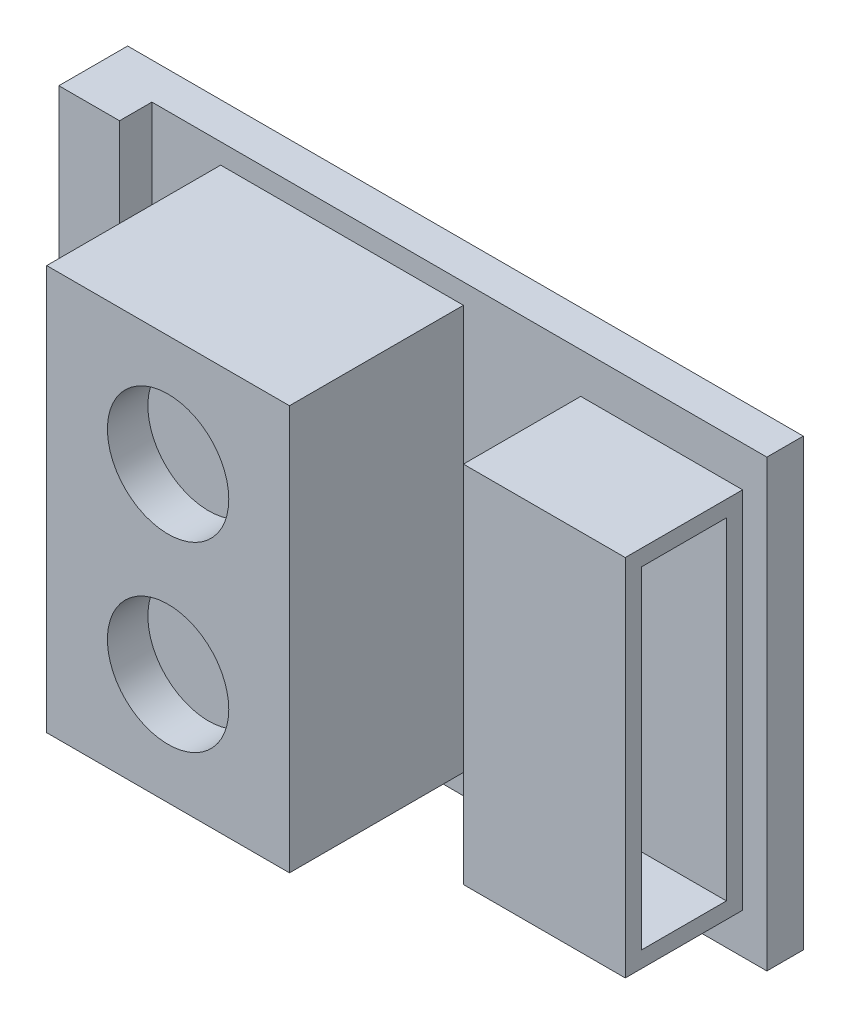
ISO-10303-21;
HEADER;
FILE_DESCRIPTION(('STEP AP214'),'2;1');
FILE_NAME('part.step','',(''),(''),'','','');
FILE_SCHEMA(('AUTOMOTIVE_DESIGN { 1 0 10303 214 1 1 1 1 }'));
ENDSEC;
DATA;
#1=APPLICATION_CONTEXT('core data for automotive mechanical design processes');
#2=APPLICATION_PROTOCOL_DEFINITION('international standard','automotive_design',2000,#1);
#3=PRODUCT_CONTEXT('',#1,'mechanical');
#4=PRODUCT('Part','Part','',(#3));
#5=PRODUCT_RELATED_PRODUCT_CATEGORY('part','',(#4));
#6=PRODUCT_DEFINITION_FORMATION('','',#4);
#7=PRODUCT_DEFINITION_CONTEXT('part definition',#1,'design');
#8=PRODUCT_DEFINITION('design','',#6,#7);
#9=PRODUCT_DEFINITION_SHAPE('','',#8);
#10=(LENGTH_UNIT() NAMED_UNIT(*) SI_UNIT(.MILLI.,.METRE.));
#11=(NAMED_UNIT(*) PLANE_ANGLE_UNIT() SI_UNIT($,.RADIAN.));
#12=(NAMED_UNIT(*) SI_UNIT($,.STERADIAN.) SOLID_ANGLE_UNIT());
#13=UNCERTAINTY_MEASURE_WITH_UNIT(LENGTH_MEASURE(1.E-05),#10,'distance_accuracy_value','');
#14=(GEOMETRIC_REPRESENTATION_CONTEXT(3) GLOBAL_UNCERTAINTY_ASSIGNED_CONTEXT((#13)) GLOBAL_UNIT_ASSIGNED_CONTEXT((#10,
#11,#12)) REPRESENTATION_CONTEXT('',''));
#15=CARTESIAN_POINT('',(0.,0.,0.));
#16=DIRECTION('',(0.,0.,1.));
#17=DIRECTION('',(1.,0.,0.));
#18=AXIS2_PLACEMENT_3D('',#15,#16,#17);
#19=CARTESIAN_POINT('',(0.,0.,0.9));
#20=DIRECTION('',(0.,0.,1.));
#21=DIRECTION('',(1.,0.,0.));
#22=AXIS2_PLACEMENT_3D('',#19,#20,#21);
#23=PLANE('',#22);
#24=DIRECTION('',(-1.,0.,0.));
#25=VECTOR('',#24,1.);
#26=CARTESIAN_POINT('',(6.81837349397589,5.74036144578313,0.9));
#27=LINE('',#26,#25);
#28=CARTESIAN_POINT('',(10.8183734939759,5.74036144578313,0.9));
#29=VERTEX_POINT('',#28);
#30=CARTESIAN_POINT('',(6.81837349397589,5.74036144578313,0.9));
#31=VERTEX_POINT('',#30);
#32=EDGE_CURVE('E260',#29,#31,#27,.T.);
#33=ORIENTED_EDGE('',*,*,#32,.F.);
#34=DIRECTION('',(0.,1.,0.));
#35=VECTOR('',#34,1.);
#36=CARTESIAN_POINT('',(10.8183734939759,5.74036144578313,0.9));
#37=LINE('',#36,#35);
#38=CARTESIAN_POINT('',(10.8183734939759,-3.25963855421687,0.9));
#39=VERTEX_POINT('',#38);
#40=EDGE_CURVE('E257',#39,#29,#37,.T.);
#41=ORIENTED_EDGE('',*,*,#40,.F.);
#42=DIRECTION('',(1.,0.,0.));
#43=VECTOR('',#42,1.);
#44=CARTESIAN_POINT('',(6.81837349397589,-3.25963855421687,0.9));
#45=LINE('',#44,#43);
#46=CARTESIAN_POINT('',(6.81837349397589,-3.25963855421687,0.9));
#47=VERTEX_POINT('',#46);
#48=EDGE_CURVE('E254',#47,#39,#45,.T.);
#49=ORIENTED_EDGE('',*,*,#48,.F.);
#50=DIRECTION('',(0.,-1.,0.));
#51=VECTOR('',#50,1.);
#52=CARTESIAN_POINT('',(6.81837349397589,5.74036144578313,0.9));
#53=LINE('',#52,#51);
#54=EDGE_CURVE('E251',#31,#47,#53,.T.);
#55=ORIENTED_EDGE('',*,*,#54,.F.);
#56=EDGE_LOOP('',(#33,#41,#49,#55));
#57=FACE_BOUND('',#56,.T.);
#58=DIRECTION('',(-1.,0.,0.));
#59=VECTOR('',#58,1.);
#60=CARTESIAN_POINT('',(-2.08162650602411,6.24036144578313,0.9));
#61=LINE('',#60,#59);
#62=CARTESIAN_POINT('',(3.91837349397589,6.24036144578313,0.9));
#63=VERTEX_POINT('',#62);
#64=CARTESIAN_POINT('',(-2.08162650602411,6.24036144578313,0.9));
#65=VERTEX_POINT('',#64);
#66=EDGE_CURVE('E286',#63,#65,#61,.T.);
#67=ORIENTED_EDGE('',*,*,#66,.F.);
#68=DIRECTION('',(0.,1.,0.));
#69=VECTOR('',#68,1.);
#70=CARTESIAN_POINT('',(3.91837349397589,6.24036144578313,0.9));
#71=LINE('',#70,#69);
#72=CARTESIAN_POINT('',(3.91837349397589,-3.75963855421686,0.9));
#73=VERTEX_POINT('',#72);
#74=EDGE_CURVE('E283',#73,#63,#71,.T.);
#75=ORIENTED_EDGE('',*,*,#74,.F.);
#76=DIRECTION('',(1.,0.,0.));
#77=VECTOR('',#76,1.);
#78=CARTESIAN_POINT('',(-2.08162650602411,-3.75963855421687,0.9));
#79=LINE('',#78,#77);
#80=CARTESIAN_POINT('',(-2.08162650602411,-3.75963855421687,0.9));
#81=VERTEX_POINT('',#80);
#82=EDGE_CURVE('E279',#81,#73,#79,.T.);
#83=ORIENTED_EDGE('',*,*,#82,.F.);
#84=DIRECTION('',(0.,-1.,0.));
#85=VECTOR('',#84,1.);
#86=CARTESIAN_POINT('',(-2.08162650602411,6.24036144578313,0.9));
#87=LINE('',#86,#85);
#88=EDGE_CURVE('E276',#65,#81,#87,.T.);
#89=ORIENTED_EDGE('',*,*,#88,.F.);
#90=EDGE_LOOP('',(#67,#75,#83,#89));
#91=FACE_BOUND('',#90,.T.);
#92=DIRECTION('',(-1.,0.,0.));
#93=VECTOR('',#92,1.);
#94=CARTESIAN_POINT('',(-5.28162650602411,6.74036144578313,0.9));
#95=LINE('',#94,#93);
#96=CARTESIAN_POINT('',(11.4183734939759,6.74036144578313,0.9));
#97=VERTEX_POINT('',#96);
#98=CARTESIAN_POINT('',(-3.78162650602411,6.74036144578313,0.9));
#99=VERTEX_POINT('',#98);
#100=EDGE_CURVE('E62',#97,#99,#95,.T.);
#101=ORIENTED_EDGE('',*,*,#100,.T.);
#102=DIRECTION('',(0.,1.,0.));
#103=VECTOR('',#102,1.);
#104=CARTESIAN_POINT('',(-3.78162650602411,6.74036144578313,0.9));
#105=LINE('',#104,#103);
#106=CARTESIAN_POINT('',(-3.78162650602411,-4.25963855421687,0.9));
#107=VERTEX_POINT('',#106);
#108=EDGE_CURVE('E66',#107,#99,#105,.T.);
#109=ORIENTED_EDGE('',*,*,#108,.F.);
#110=DIRECTION('',(1.,0.,0.));
#111=VECTOR('',#110,1.);
#112=CARTESIAN_POINT('',(-5.28162650602411,-4.25963855421687,0.9));
#113=LINE('',#112,#111);
#114=CARTESIAN_POINT('',(11.4183734939759,-4.25963855421687,0.9));
#115=VERTEX_POINT('',#114);
#116=EDGE_CURVE('E302',#107,#115,#113,.T.);
#117=ORIENTED_EDGE('',*,*,#116,.T.);
#118=DIRECTION('',(0.,1.,0.));
#119=VECTOR('',#118,1.);
#120=CARTESIAN_POINT('',(11.4183734939759,6.74036144578313,0.9));
#121=LINE('',#120,#119);
#122=EDGE_CURVE('E310',#115,#97,#121,.T.);
#123=ORIENTED_EDGE('',*,*,#122,.T.);
#124=EDGE_LOOP('',(#101,#109,#117,#123));
#125=FACE_BOUND('',#124,.T.);
#126=ADVANCED_FACE('F47',(#57,#91,#125),#23,.T.);
#127=CARTESIAN_POINT('',(6.81837349397589,5.74036144578313,0.9));
#128=DIRECTION('',(-1.,0.,0.));
#129=DIRECTION('',(0.,-1.,0.));
#130=AXIS2_PLACEMENT_3D('',#127,#128,#129);
#131=PLANE('',#130);
#132=DIRECTION('',(0.,0.,1.));
#133=VECTOR('',#132,1.);
#134=CARTESIAN_POINT('',(6.81837349397589,-3.25963855421687,0.9));
#135=LINE('',#134,#133);
#136=CARTESIAN_POINT('',(6.81837349397589,-3.25963855421687,3.8));
#137=VERTEX_POINT('',#136);
#138=EDGE_CURVE('E263',#47,#137,#135,.T.);
#139=ORIENTED_EDGE('',*,*,#138,.T.);
#140=DIRECTION('',(0.,-1.,0.));
#141=VECTOR('',#140,1.);
#142=CARTESIAN_POINT('',(6.81837349397589,5.74036144578313,3.8));
#143=LINE('',#142,#141);
#144=CARTESIAN_POINT('',(6.81837349397589,5.74036144578313,3.8));
#145=VERTEX_POINT('',#144);
#146=EDGE_CURVE('E235',#145,#137,#143,.T.);
#147=ORIENTED_EDGE('',*,*,#146,.F.);
#148=DIRECTION('',(0.,0.,1.));
#149=VECTOR('',#148,1.);
#150=CARTESIAN_POINT('',(6.81837349397589,5.74036144578313,0.9));
#151=LINE('',#150,#149);
#152=EDGE_CURVE('E264',#31,#145,#151,.T.);
#153=ORIENTED_EDGE('',*,*,#152,.F.);
#154=ORIENTED_EDGE('',*,*,#54,.T.);
#155=EDGE_LOOP('',(#139,#147,#153,#154));
#156=FACE_BOUND('',#155,.T.);
#157=ADVANCED_FACE('F351',(#156),#131,.T.);
#158=CARTESIAN_POINT('',(6.81837349397589,5.74036144578313,0.9));
#159=DIRECTION('',(0.,1.,0.));
#160=DIRECTION('',(0.,0.,1.));
#161=AXIS2_PLACEMENT_3D('',#158,#159,#160);
#162=PLANE('',#161);
#163=ORIENTED_EDGE('',*,*,#152,.T.);
#164=DIRECTION('',(-1.,0.,0.));
#165=VECTOR('',#164,1.);
#166=CARTESIAN_POINT('',(6.81837349397589,5.74036144578313,3.8));
#167=LINE('',#166,#165);
#168=CARTESIAN_POINT('',(10.8183734939759,5.74036144578313,3.8));
#169=VERTEX_POINT('',#168);
#170=EDGE_CURVE('E249',#169,#145,#167,.T.);
#171=ORIENTED_EDGE('',*,*,#170,.F.);
#172=DIRECTION('',(0.,0.,1.));
#173=VECTOR('',#172,1.);
#174=CARTESIAN_POINT('',(10.8183734939759,5.74036144578313,0.9));
#175=LINE('',#174,#173);
#176=EDGE_CURVE('E268',#29,#169,#175,.T.);
#177=ORIENTED_EDGE('',*,*,#176,.F.);
#178=ORIENTED_EDGE('',*,*,#32,.T.);
#179=EDGE_LOOP('',(#163,#171,#177,#178));
#180=FACE_BOUND('',#179,.T.);
#181=ADVANCED_FACE('F357',(#180),#162,.T.);
#182=CARTESIAN_POINT('',(10.8183734939759,5.74036144578313,0.9));
#183=DIRECTION('',(1.,0.,0.));
#184=DIRECTION('',(0.,1.,0.));
#185=AXIS2_PLACEMENT_3D('',#182,#183,#184);
#186=PLANE('',#185);
#187=DIRECTION('',(0.,1.,0.));
#188=VECTOR('',#187,1.);
#189=CARTESIAN_POINT('',(10.8183734939759,5.34036144578313,1.3));
#190=LINE('',#189,#188);
#191=CARTESIAN_POINT('',(10.8183734939759,-2.85963855421687,1.3));
#192=VERTEX_POINT('',#191);
#193=CARTESIAN_POINT('',(10.8183734939759,5.34036144578313,1.3));
#194=VERTEX_POINT('',#193);
#195=EDGE_CURVE('E199',#192,#194,#190,.T.);
#196=ORIENTED_EDGE('',*,*,#195,.F.);
#197=DIRECTION('',(0.,0.,-1.));
#198=VECTOR('',#197,1.);
#199=CARTESIAN_POINT('',(10.8183734939759,-2.85963855421687,1.3));
#200=LINE('',#199,#198);
#201=CARTESIAN_POINT('',(10.8183734939759,-2.85963855421687,3.4));
#202=VERTEX_POINT('',#201);
#203=EDGE_CURVE('E204',#202,#192,#200,.T.);
#204=ORIENTED_EDGE('',*,*,#203,.F.);
#205=DIRECTION('',(0.,-1.,0.));
#206=VECTOR('',#205,1.);
#207=CARTESIAN_POINT('',(10.8183734939759,5.34036144578313,3.4));
#208=LINE('',#207,#206);
#209=CARTESIAN_POINT('',(10.8183734939759,5.34036144578313,3.4));
#210=VERTEX_POINT('',#209);
#211=EDGE_CURVE('E218',#210,#202,#208,.T.);
#212=ORIENTED_EDGE('',*,*,#211,.F.);
#213=DIRECTION('',(0.,0.,1.));
#214=VECTOR('',#213,1.);
#215=CARTESIAN_POINT('',(10.8183734939759,5.34036144578313,1.3));
#216=LINE('',#215,#214);
#217=EDGE_CURVE('E215',#194,#210,#216,.T.);
#218=ORIENTED_EDGE('',*,*,#217,.F.);
#219=EDGE_LOOP('',(#196,#204,#212,#218));
#220=FACE_BOUND('',#219,.T.);
#221=ORIENTED_EDGE('',*,*,#176,.T.);
#222=DIRECTION('',(0.,1.,0.));
#223=VECTOR('',#222,1.);
#224=CARTESIAN_POINT('',(10.8183734939759,5.74036144578313,3.8));
#225=LINE('',#224,#223);
#226=CARTESIAN_POINT('',(10.8183734939759,-3.25963855421687,3.8));
#227=VERTEX_POINT('',#226);
#228=EDGE_CURVE('E247',#227,#169,#225,.T.);
#229=ORIENTED_EDGE('',*,*,#228,.F.);
#230=DIRECTION('',(0.,0.,1.));
#231=VECTOR('',#230,1.);
#232=CARTESIAN_POINT('',(10.8183734939759,-3.25963855421687,0.9));
#233=LINE('',#232,#231);
#234=EDGE_CURVE('E271',#39,#227,#233,.T.);
#235=ORIENTED_EDGE('',*,*,#234,.F.);
#236=ORIENTED_EDGE('',*,*,#40,.T.);
#237=EDGE_LOOP('',(#221,#229,#235,#236));
#238=FACE_BOUND('',#237,.T.);
#239=ADVANCED_FACE('F385',(#220,#238),#186,.T.);
#240=CARTESIAN_POINT('',(6.81837349397589,-3.25963855421687,0.9));
#241=DIRECTION('',(0.,-1.,0.));
#242=DIRECTION('',(0.,0.,-1.));
#243=AXIS2_PLACEMENT_3D('',#240,#241,#242);
#244=PLANE('',#243);
#245=ORIENTED_EDGE('',*,*,#234,.T.);
#246=DIRECTION('',(1.,0.,0.));
#247=VECTOR('',#246,1.);
#248=CARTESIAN_POINT('',(6.81837349397589,-3.25963855421687,3.8));
#249=LINE('',#248,#247);
#250=EDGE_CURVE('E245',#137,#227,#249,.T.);
#251=ORIENTED_EDGE('',*,*,#250,.F.);
#252=ORIENTED_EDGE('',*,*,#138,.F.);
#253=ORIENTED_EDGE('',*,*,#48,.T.);
#254=EDGE_LOOP('',(#245,#251,#252,#253));
#255=FACE_BOUND('',#254,.T.);
#256=ADVANCED_FACE('F381',(#255),#244,.T.);
#257=CARTESIAN_POINT('',(-5.28162650602411,6.74036144578313,5.2));
#258=DIRECTION('',(1.,0.,0.));
#259=DIRECTION('',(0.,1.,0.));
#260=AXIS2_PLACEMENT_3D('',#257,#258,#259);
#261=PLANE('',#260);
#262=DIRECTION('',(0.,0.,-1.));
#263=VECTOR('',#262,1.);
#264=CARTESIAN_POINT('',(-5.28162650602411,-4.25963855421687,5.2));
#265=LINE('',#264,#263);
#266=CARTESIAN_POINT('',(-5.28162650602411,-4.25963855421687,1.7));
#267=VERTEX_POINT('',#266);
#268=CARTESIAN_POINT('',(-5.28162650602411,-4.25963855421687,0.));
#269=VERTEX_POINT('',#268);
#270=EDGE_CURVE('E11',#267,#269,#265,.T.);
#271=ORIENTED_EDGE('',*,*,#270,.F.);
#272=DIRECTION('',(0.,-1.,0.));
#273=VECTOR('',#272,1.);
#274=CARTESIAN_POINT('',(-5.28162650602411,6.74036144578313,1.7));
#275=LINE('',#274,#273);
#276=CARTESIAN_POINT('',(-5.28162650602411,6.74036144578313,1.7));
#277=VERTEX_POINT('',#276);
#278=EDGE_CURVE('E171',#277,#267,#275,.T.);
#279=ORIENTED_EDGE('',*,*,#278,.F.);
#280=DIRECTION('',(0.,0.,-1.));
#281=VECTOR('',#280,1.);
#282=CARTESIAN_POINT('',(-5.28162650602411,6.74036144578313,5.2));
#283=LINE('',#282,#281);
#284=CARTESIAN_POINT('',(-5.28162650602411,6.74036144578313,0.));
#285=VERTEX_POINT('',#284);
#286=EDGE_CURVE('E322',#277,#285,#283,.T.);
#287=ORIENTED_EDGE('',*,*,#286,.T.);
#288=DIRECTION('',(0.,-1.,0.));
#289=VECTOR('',#288,1.);
#290=CARTESIAN_POINT('',(-5.28162650602411,6.74036144578313,0.));
#291=LINE('',#290,#289);
#292=EDGE_CURVE('E173',#285,#269,#291,.T.);
#293=ORIENTED_EDGE('',*,*,#292,.T.);
#294=EDGE_LOOP('',(#271,#279,#287,#293));
#295=FACE_BOUND('',#294,.T.);
#296=ADVANCED_FACE('F49',(#295),#261,.F.);
#297=CARTESIAN_POINT('',(-5.28162650602411,-4.25963855421687,5.2));
#298=DIRECTION('',(0.,1.,0.));
#299=DIRECTION('',(0.,0.,1.));
#300=AXIS2_PLACEMENT_3D('',#297,#298,#299);
#301=PLANE('',#300);
#302=ORIENTED_EDGE('',*,*,#116,.F.);
#303=DIRECTION('',(0.,0.,-1.));
#304=VECTOR('',#303,1.);
#305=CARTESIAN_POINT('',(-3.78162650602411,-4.25963855421687,1.7));
#306=LINE('',#305,#304);
#307=CARTESIAN_POINT('',(-3.78162650602411,-4.25963855421687,1.7));
#308=VERTEX_POINT('',#307);
#309=EDGE_CURVE('E181',#308,#107,#306,.T.);
#310=ORIENTED_EDGE('',*,*,#309,.F.);
#311=DIRECTION('',(1.,0.,0.));
#312=VECTOR('',#311,1.);
#313=CARTESIAN_POINT('',(-5.28162650602411,-4.25963855421687,1.7));
#314=LINE('',#313,#312);
#315=EDGE_CURVE('E178',#267,#308,#314,.T.);
#316=ORIENTED_EDGE('',*,*,#315,.F.);
#317=ORIENTED_EDGE('',*,*,#270,.T.);
#318=DIRECTION('',(1.,0.,0.));
#319=VECTOR('',#318,1.);
#320=CARTESIAN_POINT('',(-5.28162650602411,-4.25963855421687,0.));
#321=LINE('',#320,#319);
#322=CARTESIAN_POINT('',(11.4183734939759,-4.25963855421687,0.));
#323=VERTEX_POINT('',#322);
#324=EDGE_CURVE('E314',#269,#323,#321,.T.);
#325=ORIENTED_EDGE('',*,*,#324,.T.);
#326=DIRECTION('',(0.,0.,-1.));
#327=VECTOR('',#326,1.);
#328=CARTESIAN_POINT('',(11.4183734939759,-4.25963855421687,5.2));
#329=LINE('',#328,#327);
#330=EDGE_CURVE('E55',#115,#323,#329,.T.);
#331=ORIENTED_EDGE('',*,*,#330,.F.);
#332=EDGE_LOOP('',(#302,#310,#316,#317,#325,#331));
#333=FACE_BOUND('',#332,.T.);
#334=ADVANCED_FACE('F179',(#333),#301,.F.);
#335=CARTESIAN_POINT('',(11.4183734939759,6.74036144578313,5.2));
#336=DIRECTION('',(-1.,0.,0.));
#337=DIRECTION('',(0.,0.,1.));
#338=AXIS2_PLACEMENT_3D('',#335,#336,#337);
#339=PLANE('',#338);
#340=ORIENTED_EDGE('',*,*,#122,.F.);
#341=ORIENTED_EDGE('',*,*,#330,.T.);
#342=DIRECTION('',(0.,1.,0.));
#343=VECTOR('',#342,1.);
#344=CARTESIAN_POINT('',(11.4183734939759,6.74036144578313,0.));
#345=LINE('',#344,#343);
#346=CARTESIAN_POINT('',(11.4183734939759,6.74036144578313,0.));
#347=VERTEX_POINT('',#346);
#348=EDGE_CURVE('E316',#323,#347,#345,.T.);
#349=ORIENTED_EDGE('',*,*,#348,.T.);
#350=DIRECTION('',(0.,0.,-1.));
#351=VECTOR('',#350,1.);
#352=CARTESIAN_POINT('',(11.4183734939759,6.74036144578313,5.2));
#353=LINE('',#352,#351);
#354=EDGE_CURVE('E324',#97,#347,#353,.T.);
#355=ORIENTED_EDGE('',*,*,#354,.F.);
#356=EDGE_LOOP('',(#340,#341,#349,#355));
#357=FACE_BOUND('',#356,.T.);
#358=ADVANCED_FACE('F328',(#357),#339,.F.);
#359=CARTESIAN_POINT('',(-5.28162650602411,6.74036144578313,5.2));
#360=DIRECTION('',(0.,-1.,0.));
#361=DIRECTION('',(0.,0.,-1.));
#362=AXIS2_PLACEMENT_3D('',#359,#360,#361);
#363=PLANE('',#362);
#364=ORIENTED_EDGE('',*,*,#100,.F.);
#365=ORIENTED_EDGE('',*,*,#354,.T.);
#366=DIRECTION('',(-1.,0.,0.));
#367=VECTOR('',#366,1.);
#368=CARTESIAN_POINT('',(-5.28162650602411,6.74036144578313,0.));
#369=LINE('',#368,#367);
#370=EDGE_CURVE('E319',#347,#285,#369,.T.);
#371=ORIENTED_EDGE('',*,*,#370,.T.);
#372=ORIENTED_EDGE('',*,*,#286,.F.);
#373=DIRECTION('',(-1.,0.,0.));
#374=VECTOR('',#373,1.);
#375=CARTESIAN_POINT('',(-5.28162650602411,6.74036144578313,1.7));
#376=LINE('',#375,#374);
#377=CARTESIAN_POINT('',(-3.78162650602411,6.74036144578313,1.7));
#378=VERTEX_POINT('',#377);
#379=EDGE_CURVE('E189',#378,#277,#376,.T.);
#380=ORIENTED_EDGE('',*,*,#379,.F.);
#381=DIRECTION('',(0.,0.,-1.));
#382=VECTOR('',#381,1.);
#383=CARTESIAN_POINT('',(-3.78162650602411,6.74036144578313,1.7));
#384=LINE('',#383,#382);
#385=EDGE_CURVE('E194',#378,#99,#384,.T.);
#386=ORIENTED_EDGE('',*,*,#385,.T.);
#387=EDGE_LOOP('',(#364,#365,#371,#372,#380,#386));
#388=FACE_BOUND('',#387,.T.);
#389=ADVANCED_FACE('F335',(#388),#363,.F.);
#390=CARTESIAN_POINT('',(0.,0.,0.));
#391=DIRECTION('',(0.,0.,1.));
#392=DIRECTION('',(1.,0.,0.));
#393=AXIS2_PLACEMENT_3D('',#390,#391,#392);
#394=PLANE('',#393);
#395=ORIENTED_EDGE('',*,*,#292,.F.);
#396=ORIENTED_EDGE('',*,*,#370,.F.);
#397=ORIENTED_EDGE('',*,*,#348,.F.);
#398=ORIENTED_EDGE('',*,*,#324,.F.);
#399=EDGE_LOOP('',(#395,#396,#397,#398));
#400=FACE_BOUND('',#399,.T.);
#401=ADVANCED_FACE('F333',(#400),#394,.F.);
#402=CARTESIAN_POINT('',(-2.08162650602411,6.24036144578313,0.9));
#403=DIRECTION('',(-1.,0.,0.));
#404=DIRECTION('',(0.,-1.,0.));
#405=AXIS2_PLACEMENT_3D('',#402,#403,#404);
#406=PLANE('',#405);
#407=DIRECTION('',(0.,-1.,0.));
#408=VECTOR('',#407,1.);
#409=CARTESIAN_POINT('',(-2.08162650602411,6.24036144578313,5.2));
#410=LINE('',#409,#408);
#411=CARTESIAN_POINT('',(-2.08162650602411,6.24036144578313,5.2));
#412=VERTEX_POINT('',#411);
#413=CARTESIAN_POINT('',(-2.08162650602411,-3.75963855421687,5.2));
#414=VERTEX_POINT('',#413);
#415=EDGE_CURVE('E267',#412,#414,#410,.T.);
#416=ORIENTED_EDGE('',*,*,#415,.F.);
#417=DIRECTION('',(0.,0.,1.));
#418=VECTOR('',#417,1.);
#419=CARTESIAN_POINT('',(-2.08162650602411,6.24036144578313,0.9));
#420=LINE('',#419,#418);
#421=EDGE_CURVE('E300',#65,#412,#420,.T.);
#422=ORIENTED_EDGE('',*,*,#421,.F.);
#423=ORIENTED_EDGE('',*,*,#88,.T.);
#424=DIRECTION('',(0.,0.,1.));
#425=VECTOR('',#424,1.);
#426=CARTESIAN_POINT('',(-2.08162650602411,-3.75963855421687,0.9));
#427=LINE('',#426,#425);
#428=EDGE_CURVE('E289',#81,#414,#427,.T.);
#429=ORIENTED_EDGE('',*,*,#428,.T.);
#430=EDGE_LOOP('',(#416,#422,#423,#429));
#431=FACE_BOUND('',#430,.T.);
#432=ADVANCED_FACE('F364',(#431),#406,.T.);
#433=CARTESIAN_POINT('',(-2.08162650602411,6.24036144578313,0.9));
#434=DIRECTION('',(0.,1.,0.));
#435=DIRECTION('',(-1.,0.,0.));
#436=AXIS2_PLACEMENT_3D('',#433,#434,#435);
#437=PLANE('',#436);
#438=DIRECTION('',(-1.,0.,0.));
#439=VECTOR('',#438,1.);
#440=CARTESIAN_POINT('',(-2.08162650602411,6.24036144578313,5.2));
#441=LINE('',#440,#439);
#442=CARTESIAN_POINT('',(3.91837349397589,6.24036144578313,5.2));
#443=VERTEX_POINT('',#442);
#444=EDGE_CURVE('E280',#443,#412,#441,.T.);
#445=ORIENTED_EDGE('',*,*,#444,.F.);
#446=DIRECTION('',(0.,0.,1.));
#447=VECTOR('',#446,1.);
#448=CARTESIAN_POINT('',(3.91837349397589,6.24036144578313,0.9));
#449=LINE('',#448,#447);
#450=EDGE_CURVE('E303',#63,#443,#449,.T.);
#451=ORIENTED_EDGE('',*,*,#450,.F.);
#452=ORIENTED_EDGE('',*,*,#66,.T.);
#453=ORIENTED_EDGE('',*,*,#421,.T.);
#454=EDGE_LOOP('',(#445,#451,#452,#453));
#455=FACE_BOUND('',#454,.T.);
#456=ADVANCED_FACE('F395',(#455),#437,.T.);
#457=CARTESIAN_POINT('',(3.91837349397589,6.24036144578313,0.9));
#458=DIRECTION('',(1.,0.,0.));
#459=DIRECTION('',(0.,1.,0.));
#460=AXIS2_PLACEMENT_3D('',#457,#458,#459);
#461=PLANE('',#460);
#462=DIRECTION('',(0.,1.,0.));
#463=VECTOR('',#462,1.);
#464=CARTESIAN_POINT('',(3.91837349397589,6.24036144578313,5.2));
#465=LINE('',#464,#463);
#466=CARTESIAN_POINT('',(3.91837349397589,-3.75963855421686,5.2));
#467=VERTEX_POINT('',#466);
#468=EDGE_CURVE('E295',#467,#443,#465,.T.);
#469=ORIENTED_EDGE('',*,*,#468,.F.);
#470=DIRECTION('',(0.,0.,1.));
#471=VECTOR('',#470,1.);
#472=CARTESIAN_POINT('',(3.91837349397589,-3.75963855421686,0.9));
#473=LINE('',#472,#471);
#474=EDGE_CURVE('E305',#73,#467,#473,.T.);
#475=ORIENTED_EDGE('',*,*,#474,.F.);
#476=ORIENTED_EDGE('',*,*,#74,.T.);
#477=ORIENTED_EDGE('',*,*,#450,.T.);
#478=EDGE_LOOP('',(#469,#475,#476,#477));
#479=FACE_BOUND('',#478,.T.);
#480=ADVANCED_FACE('F398',(#479),#461,.T.);
#481=CARTESIAN_POINT('',(-2.08162650602411,-3.75963855421687,0.9));
#482=DIRECTION('',(0.,-1.,0.));
#483=DIRECTION('',(1.,0.,0.));
#484=AXIS2_PLACEMENT_3D('',#481,#482,#483);
#485=PLANE('',#484);
#486=DIRECTION('',(1.,0.,0.));
#487=VECTOR('',#486,1.);
#488=CARTESIAN_POINT('',(-2.08162650602411,-3.75963855421687,5.2));
#489=LINE('',#488,#487);
#490=EDGE_CURVE('E292',#414,#467,#489,.T.);
#491=ORIENTED_EDGE('',*,*,#490,.F.);
#492=ORIENTED_EDGE('',*,*,#428,.F.);
#493=ORIENTED_EDGE('',*,*,#82,.T.);
#494=ORIENTED_EDGE('',*,*,#474,.T.);
#495=EDGE_LOOP('',(#491,#492,#493,#494));
#496=FACE_BOUND('',#495,.T.);
#497=ADVANCED_FACE('F370',(#496),#485,.T.);
#498=CARTESIAN_POINT('',(0.,0.,5.2));
#499=DIRECTION('',(0.,0.,1.));
#500=DIRECTION('',(1.,0.,0.));
#501=AXIS2_PLACEMENT_3D('',#498,#499,#500);
#502=PLANE('',#501);
#503=CARTESIAN_POINT('',(0.91837349397589,3.49036144578313,5.2));
#504=DIRECTION('',(0.,0.,1.));
#505=DIRECTION('',(1.,0.,0.));
#506=AXIS2_PLACEMENT_3D('',#503,#504,#505);
#507=CIRCLE('',#506,1.5);
#508=CARTESIAN_POINT('',(2.41837349397589,3.49036144578313,5.2));
#509=VERTEX_POINT('',#508);
#510=EDGE_CURVE('E236',#509,#509,#507,.T.);
#511=ORIENTED_EDGE('',*,*,#510,.F.);
#512=EDGE_LOOP('',(#511));
#513=FACE_BOUND('',#512,.T.);
#514=CARTESIAN_POINT('',(0.91837349397589,-1.00963855421687,5.2));
#515=DIRECTION('',(0.,0.,1.));
#516=DIRECTION('',(1.,0.,0.));
#517=AXIS2_PLACEMENT_3D('',#514,#515,#516);
#518=CIRCLE('',#517,1.5);
#519=CARTESIAN_POINT('',(2.41837349397589,-1.00963855421687,5.2));
#520=VERTEX_POINT('',#519);
#521=EDGE_CURVE('E225',#520,#520,#518,.T.);
#522=ORIENTED_EDGE('',*,*,#521,.F.);
#523=EDGE_LOOP('',(#522));
#524=FACE_BOUND('',#523,.T.);
#525=ORIENTED_EDGE('',*,*,#444,.T.);
#526=ORIENTED_EDGE('',*,*,#415,.T.);
#527=ORIENTED_EDGE('',*,*,#490,.T.);
#528=ORIENTED_EDGE('',*,*,#468,.T.);
#529=EDGE_LOOP('',(#525,#526,#527,#528));
#530=FACE_BOUND('',#529,.T.);
#531=ADVANCED_FACE('F366',(#513,#524,#530),#502,.T.);
#532=CARTESIAN_POINT('',(0.,0.,3.8));
#533=DIRECTION('',(0.,0.,1.));
#534=DIRECTION('',(1.,0.,0.));
#535=AXIS2_PLACEMENT_3D('',#532,#533,#534);
#536=PLANE('',#535);
#537=ORIENTED_EDGE('',*,*,#146,.T.);
#538=ORIENTED_EDGE('',*,*,#250,.T.);
#539=ORIENTED_EDGE('',*,*,#228,.T.);
#540=ORIENTED_EDGE('',*,*,#170,.T.);
#541=EDGE_LOOP('',(#537,#538,#539,#540));
#542=FACE_BOUND('',#541,.T.);
#543=ADVANCED_FACE('F369',(#542),#536,.T.);
#544=CARTESIAN_POINT('',(0.91837349397589,-1.00963855421687,4.2));
#545=DIRECTION('',(0.,0.,1.));
#546=DIRECTION('',(1.,0.,0.));
#547=AXIS2_PLACEMENT_3D('',#544,#545,#546);
#548=CYLINDRICAL_SURFACE('',#547,1.5);
#549=CARTESIAN_POINT('',(0.91837349397589,-1.00963855421687,4.2));
#550=DIRECTION('',(0.,0.,1.));
#551=DIRECTION('',(1.,0.,0.));
#552=AXIS2_PLACEMENT_3D('',#549,#550,#551);
#553=CIRCLE('',#552,1.5);
#554=CARTESIAN_POINT('',(2.41837349397589,-1.00963855421687,4.2));
#555=VERTEX_POINT('',#554);
#556=EDGE_CURVE('E239',#555,#555,#553,.T.);
#557=ORIENTED_EDGE('',*,*,#556,.F.);
#558=EDGE_LOOP('',(#557));
#559=FACE_BOUND('',#558,.T.);
#560=ORIENTED_EDGE('',*,*,#521,.T.);
#561=EDGE_LOOP('',(#560));
#562=FACE_BOUND('',#561,.T.);
#563=ADVANCED_FACE('F450',(#559,#562),#548,.F.);
#564=CARTESIAN_POINT('',(0.91837349397589,-1.00963855421687,4.2));
#565=DIRECTION('',(0.,0.,1.));
#566=DIRECTION('',(1.,0.,0.));
#567=AXIS2_PLACEMENT_3D('',#564,#565,#566);
#568=PLANE('',#567);
#569=ORIENTED_EDGE('',*,*,#556,.T.);
#570=EDGE_LOOP('',(#569));
#571=FACE_BOUND('',#570,.T.);
#572=ADVANCED_FACE('F461',(#571),#568,.T.);
#573=CARTESIAN_POINT('',(0.91837349397589,3.49036144578313,4.2));
#574=DIRECTION('',(0.,0.,1.));
#575=DIRECTION('',(1.,0.,0.));
#576=AXIS2_PLACEMENT_3D('',#573,#574,#575);
#577=CYLINDRICAL_SURFACE('',#576,1.5);
#578=CARTESIAN_POINT('',(0.91837349397589,3.49036144578313,4.2));
#579=DIRECTION('',(0.,0.,1.));
#580=DIRECTION('',(1.,0.,0.));
#581=AXIS2_PLACEMENT_3D('',#578,#579,#580);
#582=CIRCLE('',#581,1.5);
#583=CARTESIAN_POINT('',(2.41837349397589,3.49036144578313,4.2));
#584=VERTEX_POINT('',#583);
#585=EDGE_CURVE('E232',#584,#584,#582,.T.);
#586=ORIENTED_EDGE('',*,*,#585,.F.);
#587=EDGE_LOOP('',(#586));
#588=FACE_BOUND('',#587,.T.);
#589=ORIENTED_EDGE('',*,*,#510,.T.);
#590=EDGE_LOOP('',(#589));
#591=FACE_BOUND('',#590,.T.);
#592=ADVANCED_FACE('F469',(#588,#591),#577,.F.);
#593=CARTESIAN_POINT('',(0.91837349397589,3.49036144578313,4.2));
#594=DIRECTION('',(0.,0.,1.));
#595=DIRECTION('',(1.,0.,0.));
#596=AXIS2_PLACEMENT_3D('',#593,#594,#595);
#597=PLANE('',#596);
#598=ORIENTED_EDGE('',*,*,#585,.T.);
#599=EDGE_LOOP('',(#598));
#600=FACE_BOUND('',#599,.T.);
#601=ADVANCED_FACE('F472',(#600),#597,.T.);
#602=CARTESIAN_POINT('',(7.81837349397589,5.34036144578313,1.3));
#603=DIRECTION('',(0.,0.,-1.));
#604=DIRECTION('',(0.,1.,0.));
#605=AXIS2_PLACEMENT_3D('',#602,#603,#604);
#606=PLANE('',#605);
#607=ORIENTED_EDGE('',*,*,#195,.T.);
#608=DIRECTION('',(1.,0.,0.));
#609=VECTOR('',#608,1.);
#610=CARTESIAN_POINT('',(7.81837349397589,5.34036144578313,1.3));
#611=LINE('',#610,#609);
#612=CARTESIAN_POINT('',(7.81837349397589,5.34036144578313,1.3));
#613=VERTEX_POINT('',#612);
#614=EDGE_CURVE('E213',#613,#194,#611,.T.);
#615=ORIENTED_EDGE('',*,*,#614,.F.);
#616=DIRECTION('',(0.,1.,0.));
#617=VECTOR('',#616,1.);
#618=CARTESIAN_POINT('',(7.81837349397589,5.34036144578313,1.3));
#619=LINE('',#618,#617);
#620=CARTESIAN_POINT('',(7.8183734939759,-2.85963855421687,1.3));
#621=VERTEX_POINT('',#620);
#622=EDGE_CURVE('E200',#621,#613,#619,.T.);
#623=ORIENTED_EDGE('',*,*,#622,.F.);
#624=DIRECTION('',(1.,0.,0.));
#625=VECTOR('',#624,1.);
#626=CARTESIAN_POINT('',(7.8183734939759,-2.85963855421687,1.3));
#627=LINE('',#626,#625);
#628=EDGE_CURVE('E223',#621,#192,#627,.T.);
#629=ORIENTED_EDGE('',*,*,#628,.T.);
#630=EDGE_LOOP('',(#607,#615,#623,#629));
#631=FACE_BOUND('',#630,.T.);
#632=ADVANCED_FACE('F479',(#631),#606,.F.);
#633=CARTESIAN_POINT('',(7.8183734939759,-2.85963855421687,1.3));
#634=DIRECTION('',(0.,-1.,0.));
#635=DIRECTION('',(0.,0.,-1.));
#636=AXIS2_PLACEMENT_3D('',#633,#634,#635);
#637=PLANE('',#636);
#638=ORIENTED_EDGE('',*,*,#203,.T.);
#639=ORIENTED_EDGE('',*,*,#628,.F.);
#640=DIRECTION('',(0.,0.,-1.));
#641=VECTOR('',#640,1.);
#642=CARTESIAN_POINT('',(7.8183734939759,-2.85963855421687,1.3));
#643=LINE('',#642,#641);
#644=CARTESIAN_POINT('',(7.8183734939759,-2.85963855421687,3.4));
#645=VERTEX_POINT('',#644);
#646=EDGE_CURVE('E210',#645,#621,#643,.T.);
#647=ORIENTED_EDGE('',*,*,#646,.F.);
#648=DIRECTION('',(1.,0.,0.));
#649=VECTOR('',#648,1.);
#650=CARTESIAN_POINT('',(7.8183734939759,-2.85963855421687,3.4));
#651=LINE('',#650,#649);
#652=EDGE_CURVE('E226',#645,#202,#651,.T.);
#653=ORIENTED_EDGE('',*,*,#652,.T.);
#654=EDGE_LOOP('',(#638,#639,#647,#653));
#655=FACE_BOUND('',#654,.T.);
#656=ADVANCED_FACE('F483',(#655),#637,.F.);
#657=CARTESIAN_POINT('',(7.81837349397589,5.34036144578313,3.4));
#658=DIRECTION('',(0.,0.,1.));
#659=DIRECTION('',(0.,-1.,0.));
#660=AXIS2_PLACEMENT_3D('',#657,#658,#659);
#661=PLANE('',#660);
#662=ORIENTED_EDGE('',*,*,#211,.T.);
#663=ORIENTED_EDGE('',*,*,#652,.F.);
#664=DIRECTION('',(0.,-1.,0.));
#665=VECTOR('',#664,1.);
#666=CARTESIAN_POINT('',(7.81837349397589,5.34036144578313,3.4));
#667=LINE('',#666,#665);
#668=CARTESIAN_POINT('',(7.81837349397589,5.34036144578313,3.4));
#669=VERTEX_POINT('',#668);
#670=EDGE_CURVE('E207',#669,#645,#667,.T.);
#671=ORIENTED_EDGE('',*,*,#670,.F.);
#672=DIRECTION('',(1.,0.,0.));
#673=VECTOR('',#672,1.);
#674=CARTESIAN_POINT('',(7.81837349397589,5.34036144578313,3.4));
#675=LINE('',#674,#673);
#676=EDGE_CURVE('E228',#669,#210,#675,.T.);
#677=ORIENTED_EDGE('',*,*,#676,.T.);
#678=EDGE_LOOP('',(#662,#663,#671,#677));
#679=FACE_BOUND('',#678,.T.);
#680=ADVANCED_FACE('F494',(#679),#661,.F.);
#681=CARTESIAN_POINT('',(7.81837349397589,5.34036144578313,1.3));
#682=DIRECTION('',(0.,1.,0.));
#683=DIRECTION('',(-1.,0.,0.));
#684=AXIS2_PLACEMENT_3D('',#681,#682,#683);
#685=PLANE('',#684);
#686=ORIENTED_EDGE('',*,*,#217,.T.);
#687=ORIENTED_EDGE('',*,*,#676,.F.);
#688=DIRECTION('',(0.,0.,1.));
#689=VECTOR('',#688,1.);
#690=CARTESIAN_POINT('',(7.81837349397589,5.34036144578313,1.3));
#691=LINE('',#690,#689);
#692=EDGE_CURVE('E203',#613,#669,#691,.T.);
#693=ORIENTED_EDGE('',*,*,#692,.F.);
#694=ORIENTED_EDGE('',*,*,#614,.T.);
#695=EDGE_LOOP('',(#686,#687,#693,#694));
#696=FACE_BOUND('',#695,.T.);
#697=ADVANCED_FACE('F347',(#696),#685,.F.);
#698=CARTESIAN_POINT('',(7.8183734939759,0.,0.));
#699=DIRECTION('',(-1.,0.,0.));
#700=DIRECTION('',(0.,-1.,0.));
#701=AXIS2_PLACEMENT_3D('',#698,#699,#700);
#702=PLANE('',#701);
#703=ORIENTED_EDGE('',*,*,#622,.T.);
#704=ORIENTED_EDGE('',*,*,#692,.T.);
#705=ORIENTED_EDGE('',*,*,#670,.T.);
#706=ORIENTED_EDGE('',*,*,#646,.T.);
#707=EDGE_LOOP('',(#703,#704,#705,#706));
#708=FACE_BOUND('',#707,.T.);
#709=ADVANCED_FACE('F340',(#708),#702,.F.);
#710=CARTESIAN_POINT('',(-3.78162650602411,6.74036144578313,1.7));
#711=DIRECTION('',(-1.,0.,0.));
#712=DIRECTION('',(0.,-1.,0.));
#713=AXIS2_PLACEMENT_3D('',#710,#711,#712);
#714=PLANE('',#713);
#715=ORIENTED_EDGE('',*,*,#108,.T.);
#716=ORIENTED_EDGE('',*,*,#385,.F.);
#717=DIRECTION('',(0.,1.,0.));
#718=VECTOR('',#717,1.);
#719=CARTESIAN_POINT('',(-3.78162650602411,6.74036144578313,1.7));
#720=LINE('',#719,#718);
#721=EDGE_CURVE('E184',#308,#378,#720,.T.);
#722=ORIENTED_EDGE('',*,*,#721,.F.);
#723=ORIENTED_EDGE('',*,*,#309,.T.);
#724=EDGE_LOOP('',(#715,#716,#722,#723));
#725=FACE_BOUND('',#724,.T.);
#726=ADVANCED_FACE('F338',(#725),#714,.F.);
#727=CARTESIAN_POINT('',(0.,0.,1.7));
#728=DIRECTION('',(0.,0.,1.));
#729=DIRECTION('',(1.,0.,0.));
#730=AXIS2_PLACEMENT_3D('',#727,#728,#729);
#731=PLANE('',#730);
#732=ORIENTED_EDGE('',*,*,#278,.T.);
#733=ORIENTED_EDGE('',*,*,#315,.T.);
#734=ORIENTED_EDGE('',*,*,#721,.T.);
#735=ORIENTED_EDGE('',*,*,#379,.T.);
#736=EDGE_LOOP('',(#732,#733,#734,#735));
#737=FACE_BOUND('',#736,.T.);
#738=ADVANCED_FACE('F187',(#737),#731,.T.);
#739=CLOSED_SHELL('',(#126,#157,#181,#239,#256,#296,#334,#358,#389,#401,#432,#456,#480,#497,
#531,#543,#563,#572,#592,#601,#632,#656,#680,#697,#709,#726,#738));
#740=MANIFOLD_SOLID_BREP('B2',#739);
#741=ADVANCED_BREP_SHAPE_REPRESENTATION('',(#18,#740),#14);
#742=SHAPE_DEFINITION_REPRESENTATION(#9,#741);
ENDSEC;
END-ISO-10303-21;
